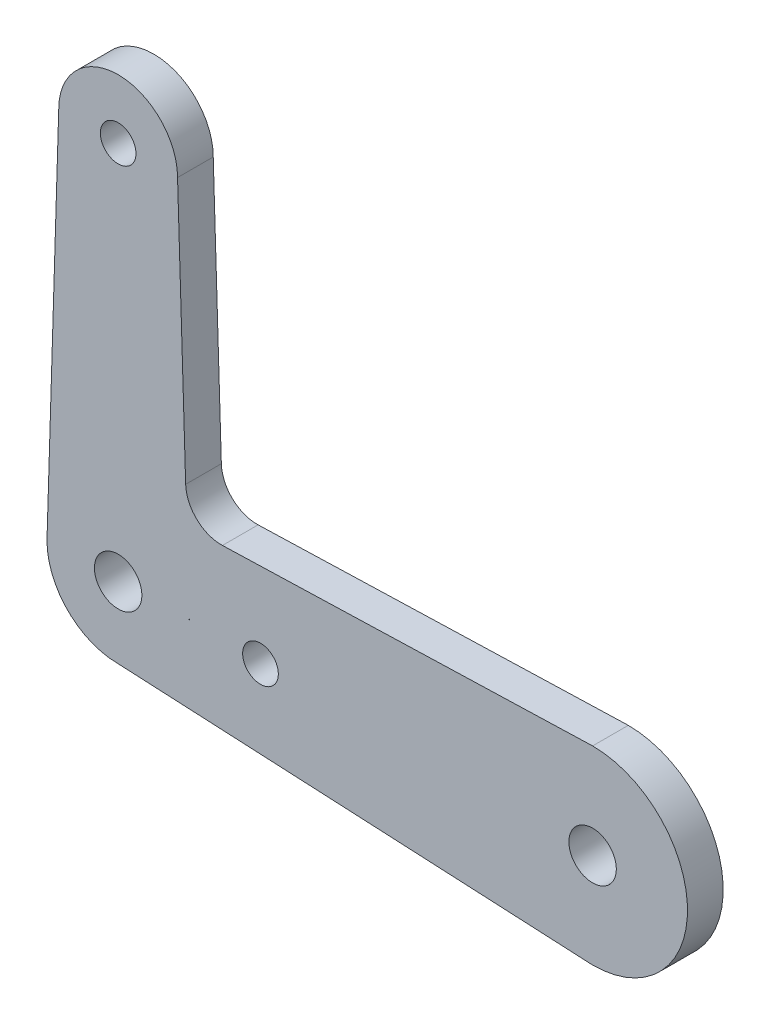
ISO-10303-21;
HEADER;
FILE_DESCRIPTION(('STEP AP214'),'2;1');
FILE_NAME('part.step','',(''),(''),'','','');
FILE_SCHEMA(('AUTOMOTIVE_DESIGN { 1 0 10303 214 1 1 1 1 }'));
ENDSEC;
DATA;
#1=APPLICATION_CONTEXT('core data for automotive mechanical design processes');
#2=APPLICATION_PROTOCOL_DEFINITION('international standard','automotive_design',2000,#1);
#3=PRODUCT_CONTEXT('',#1,'mechanical');
#4=PRODUCT('Part','Part','',(#3));
#5=PRODUCT_RELATED_PRODUCT_CATEGORY('part','',(#4));
#6=PRODUCT_DEFINITION_FORMATION('','',#4);
#7=PRODUCT_DEFINITION_CONTEXT('part definition',#1,'design');
#8=PRODUCT_DEFINITION('design','',#6,#7);
#9=PRODUCT_DEFINITION_SHAPE('','',#8);
#10=(LENGTH_UNIT() NAMED_UNIT(*) SI_UNIT(.MILLI.,.METRE.));
#11=(NAMED_UNIT(*) PLANE_ANGLE_UNIT() SI_UNIT($,.RADIAN.));
#12=(NAMED_UNIT(*) SI_UNIT($,.STERADIAN.) SOLID_ANGLE_UNIT());
#13=UNCERTAINTY_MEASURE_WITH_UNIT(LENGTH_MEASURE(1.E-05),#10,'distance_accuracy_value','');
#14=(GEOMETRIC_REPRESENTATION_CONTEXT(3) GLOBAL_UNCERTAINTY_ASSIGNED_CONTEXT((#13)) GLOBAL_UNIT_ASSIGNED_CONTEXT((#10,
#11,#12)) REPRESENTATION_CONTEXT('',''));
#15=CARTESIAN_POINT('',(0.,0.,0.));
#16=DIRECTION('',(0.,0.,1.));
#17=DIRECTION('',(1.,0.,0.));
#18=AXIS2_PLACEMENT_3D('',#15,#16,#17);
#19=CARTESIAN_POINT('',(-0.475062344139632,-9.50124688279302,4.7752));
#20=DIRECTION('',(0.0499376169438923,0.998752338877845,0.));
#21=DIRECTION('',(-0.998752338877846,0.0499376169438924,0.));
#22=AXIS2_PLACEMENT_3D('',#19,#20,#21);
#23=PLANE('',#22);
#24=DIRECTION('',(0.998752338877845,-0.0499376169438923,0.));
#25=VECTOR('',#24,1.);
#26=CARTESIAN_POINT('',(-0.475062344139646,-9.50124688279302,0.));
#27=LINE('',#26,#25);
#28=CARTESIAN_POINT('',(0.,-9.52500000000002,0.));
#29=VERTEX_POINT('',#28);
#30=CARTESIAN_POINT('',(63.5000000000001,-12.7,0.));
#31=VERTEX_POINT('',#30);
#32=EDGE_CURVE('E161',#29,#31,#27,.T.);
#33=ORIENTED_EDGE('',*,*,#32,.T.);
#34=DIRECTION('',(0.,0.,-1.));
#35=VECTOR('',#34,1.);
#36=CARTESIAN_POINT('',(63.5000000000001,-12.7,4.7752));
#37=LINE('',#36,#35);
#38=CARTESIAN_POINT('',(63.5000000000001,-12.7,4.7752));
#39=VERTEX_POINT('',#38);
#40=EDGE_CURVE('E187',#39,#31,#37,.T.);
#41=ORIENTED_EDGE('',*,*,#40,.F.);
#42=DIRECTION('',(0.998752338877845,-0.0499376169438923,0.));
#43=VECTOR('',#42,1.);
#44=CARTESIAN_POINT('',(-0.475062344139632,-9.50124688279302,4.7752));
#45=LINE('',#44,#43);
#46=CARTESIAN_POINT('',(0.,-9.52500000000002,4.7752));
#47=VERTEX_POINT('',#46);
#48=EDGE_CURVE('E131',#47,#39,#45,.T.);
#49=ORIENTED_EDGE('',*,*,#48,.F.);
#50=DIRECTION('',(0.,0.,-1.));
#51=VECTOR('',#50,1.);
#52=CARTESIAN_POINT('',(0.,-9.52500000000002,4.7752));
#53=LINE('',#52,#51);
#54=EDGE_CURVE('E124',#47,#29,#53,.T.);
#55=ORIENTED_EDGE('',*,*,#54,.T.);
#56=EDGE_LOOP('',(#33,#41,#49,#55));
#57=FACE_BOUND('',#56,.T.);
#58=ADVANCED_FACE('F37',(#57),#23,.F.);
#59=CARTESIAN_POINT('',(63.5000000000001,0.,4.7752));
#60=DIRECTION('',(0.,0.,-1.));
#61=DIRECTION('',(-1.,0.,0.));
#62=AXIS2_PLACEMENT_3D('',#59,#60,#61);
#63=CYLINDRICAL_SURFACE('',#62,12.7);
#64=CARTESIAN_POINT('',(63.5000000000001,0.,0.));
#65=DIRECTION('',(0.,0.,1.));
#66=DIRECTION('',(1.,0.,0.));
#67=AXIS2_PLACEMENT_3D('',#64,#65,#66);
#68=CIRCLE('',#67,12.7);
#69=CARTESIAN_POINT('',(63.5000000000001,12.7,0.));
#70=VERTEX_POINT('',#69);
#71=EDGE_CURVE('E164',#31,#70,#68,.T.);
#72=ORIENTED_EDGE('',*,*,#71,.T.);
#73=DIRECTION('',(0.,0.,-1.));
#74=VECTOR('',#73,1.);
#75=CARTESIAN_POINT('',(63.5000000000001,12.7,4.7752));
#76=LINE('',#75,#74);
#77=CARTESIAN_POINT('',(63.5000000000001,12.7,4.7752));
#78=VERTEX_POINT('',#77);
#79=EDGE_CURVE('E184',#78,#70,#76,.T.);
#80=ORIENTED_EDGE('',*,*,#79,.F.);
#81=CARTESIAN_POINT('',(63.5000000000001,0.,4.7752));
#82=DIRECTION('',(0.,0.,1.));
#83=DIRECTION('',(1.,0.,0.));
#84=AXIS2_PLACEMENT_3D('',#81,#82,#83);
#85=CIRCLE('',#84,12.7);
#86=EDGE_CURVE('E145',#39,#78,#85,.T.);
#87=ORIENTED_EDGE('',*,*,#86,.F.);
#88=ORIENTED_EDGE('',*,*,#40,.T.);
#89=EDGE_LOOP('',(#72,#80,#87,#88));
#90=FACE_BOUND('',#89,.T.);
#91=ADVANCED_FACE('F228',(#90),#63,.T.);
#92=CARTESIAN_POINT('',(-0.332357104822267,10.7211969297505,4.7752));
#93=DIRECTION('',(0.0309851152273412,-0.999519846043264,0.));
#94=DIRECTION('',(0.999519846043264,0.0309851152273412,0.));
#95=AXIS2_PLACEMENT_3D('',#92,#93,#94);
#96=PLANE('',#95);
#97=DIRECTION('',(-0.999519846043264,-0.0309851152273412,0.));
#98=VECTOR('',#97,1.);
#99=CARTESIAN_POINT('',(-0.332357104822281,10.7211969297505,0.));
#100=LINE('',#99,#98);
#101=CARTESIAN_POINT('',(13.9564053270957,11.16414856514,0.));
#102=VERTEX_POINT('',#101);
#103=EDGE_CURVE('E166',#70,#102,#100,.T.);
#104=ORIENTED_EDGE('',*,*,#103,.T.);
#105=DIRECTION('',(0.,0.,-1.));
#106=VECTOR('',#105,1.);
#107=CARTESIAN_POINT('',(13.9564053270957,11.16414856514,4.7752));
#108=LINE('',#107,#106);
#109=CARTESIAN_POINT('',(13.9564053270957,11.16414856514,4.7752));
#110=VERTEX_POINT('',#109);
#111=EDGE_CURVE('E52',#102,#110,#108,.F.);
#112=ORIENTED_EDGE('',*,*,#111,.T.);
#113=DIRECTION('',(-0.999519846043264,-0.0309851152273412,0.));
#114=VECTOR('',#113,1.);
#115=CARTESIAN_POINT('',(-0.332357104822267,10.7211969297505,4.7752));
#116=LINE('',#115,#114);
#117=EDGE_CURVE('E147',#78,#110,#116,.T.);
#118=ORIENTED_EDGE('',*,*,#117,.F.);
#119=ORIENTED_EDGE('',*,*,#79,.T.);
#120=EDGE_LOOP('',(#104,#112,#118,#119));
#121=FACE_BOUND('',#120,.T.);
#122=ADVANCED_FACE('F234',(#121),#96,.F.);
#123=CARTESIAN_POINT('',(9.51585526309218,0.294991513155853,4.7752));
#124=DIRECTION('',(-0.999519846043264,-0.0309851152273412,0.));
#125=DIRECTION('',(0.0309851152273412,-0.999519846043264,0.));
#126=AXIS2_PLACEMENT_3D('',#123,#124,#125);
#127=PLANE('',#126);
#128=DIRECTION('',(-0.0309851152273412,0.999519846043264,0.));
#129=VECTOR('',#128,1.);
#130=CARTESIAN_POINT('',(9.51585526309218,0.294991513155853,4.7752));
#131=LINE('',#130,#129);
#132=CARTESIAN_POINT('',(9.03553803603632,15.7890956117322,4.7752));
#133=VERTEX_POINT('',#132);
#134=CARTESIAN_POINT('',(7.95020000000002,50.8,4.7752));
#135=VERTEX_POINT('',#134);
#136=EDGE_CURVE('E149',#133,#135,#131,.T.);
#137=ORIENTED_EDGE('',*,*,#136,.F.);
#138=DIRECTION('',(0.,0.,-1.));
#139=VECTOR('',#138,1.);
#140=CARTESIAN_POINT('',(9.03553803603631,15.7890956117322,0.));
#141=LINE('',#140,#139);
#142=CARTESIAN_POINT('',(9.03553803603631,15.7890956117322,0.));
#143=VERTEX_POINT('',#142);
#144=EDGE_CURVE('E190',#133,#143,#141,.T.);
#145=ORIENTED_EDGE('',*,*,#144,.T.);
#146=DIRECTION('',(-0.0309851152273412,0.999519846043264,0.));
#147=VECTOR('',#146,1.);
#148=CARTESIAN_POINT('',(9.51585526309216,0.294991513155853,0.));
#149=LINE('',#148,#147);
#150=CARTESIAN_POINT('',(7.95020000000003,50.8,0.));
#151=VERTEX_POINT('',#150);
#152=EDGE_CURVE('E168',#143,#151,#149,.T.);
#153=ORIENTED_EDGE('',*,*,#152,.T.);
#154=DIRECTION('',(0.,0.,-1.));
#155=VECTOR('',#154,1.);
#156=CARTESIAN_POINT('',(7.95020000000002,50.8,4.7752));
#157=LINE('',#156,#155);
#158=EDGE_CURVE('E181',#135,#151,#157,.T.);
#159=ORIENTED_EDGE('',*,*,#158,.F.);
#160=EDGE_LOOP('',(#137,#145,#153,#159));
#161=FACE_BOUND('',#160,.T.);
#162=ADVANCED_FACE('F197',(#161),#127,.F.);
#163=CARTESIAN_POINT('',(0.,50.8,4.7752));
#164=DIRECTION('',(0.,0.,-1.));
#165=DIRECTION('',(-1.,0.,0.));
#166=AXIS2_PLACEMENT_3D('',#163,#164,#165);
#167=CYLINDRICAL_SURFACE('',#166,7.9502);
#168=CARTESIAN_POINT('',(0.,50.8,0.));
#169=DIRECTION('',(0.,0.,1.));
#170=DIRECTION('',(1.,0.,0.));
#171=AXIS2_PLACEMENT_3D('',#168,#169,#170);
#172=CIRCLE('',#171,7.9502);
#173=CARTESIAN_POINT('',(-7.9502,50.8,0.));
#174=VERTEX_POINT('',#173);
#175=EDGE_CURVE('E170',#151,#174,#172,.T.);
#176=ORIENTED_EDGE('',*,*,#175,.T.);
#177=DIRECTION('',(0.,0.,-1.));
#178=VECTOR('',#177,1.);
#179=CARTESIAN_POINT('',(-7.9502,50.8,4.7752));
#180=LINE('',#179,#178);
#181=CARTESIAN_POINT('',(-7.9502,50.8,4.7752));
#182=VERTEX_POINT('',#181);
#183=EDGE_CURVE('E178',#182,#174,#180,.T.);
#184=ORIENTED_EDGE('',*,*,#183,.F.);
#185=CARTESIAN_POINT('',(0.,50.8,4.7752));
#186=DIRECTION('',(0.,0.,1.));
#187=DIRECTION('',(1.,0.,0.));
#188=AXIS2_PLACEMENT_3D('',#185,#186,#187);
#189=CIRCLE('',#188,7.9502);
#190=EDGE_CURVE('E151',#135,#182,#189,.T.);
#191=ORIENTED_EDGE('',*,*,#190,.F.);
#192=ORIENTED_EDGE('',*,*,#158,.T.);
#193=EDGE_LOOP('',(#176,#184,#191,#192));
#194=FACE_BOUND('',#193,.T.);
#195=ADVANCED_FACE('F208',(#194),#167,.T.);
#196=CARTESIAN_POINT('',(-9.51585526309218,0.294991513155873,4.7752));
#197=DIRECTION('',(0.999519846043264,-0.0309851152273413,0.));
#198=DIRECTION('',(0.0309851152273413,0.999519846043264,0.));
#199=AXIS2_PLACEMENT_3D('',#196,#197,#198);
#200=PLANE('',#199);
#201=DIRECTION('',(-0.0309851152273413,-0.999519846043264,0.));
#202=VECTOR('',#201,1.);
#203=CARTESIAN_POINT('',(-9.51585526309218,0.294991513155873,0.));
#204=LINE('',#203,#202);
#205=CARTESIAN_POINT('',(-9.52499999999998,0.,0.));
#206=VERTEX_POINT('',#205);
#207=EDGE_CURVE('E137',#174,#206,#204,.T.);
#208=ORIENTED_EDGE('',*,*,#207,.T.);
#209=DIRECTION('',(0.,0.,-1.));
#210=VECTOR('',#209,1.);
#211=CARTESIAN_POINT('',(-9.52499999999998,0.,4.7752));
#212=LINE('',#211,#210);
#213=CARTESIAN_POINT('',(-9.52499999999998,0.,4.7752));
#214=VERTEX_POINT('',#213);
#215=EDGE_CURVE('E175',#214,#206,#212,.T.);
#216=ORIENTED_EDGE('',*,*,#215,.F.);
#217=DIRECTION('',(-0.0309851152273413,-0.999519846043264,0.));
#218=VECTOR('',#217,1.);
#219=CARTESIAN_POINT('',(-9.51585526309218,0.294991513155873,4.7752));
#220=LINE('',#219,#218);
#221=EDGE_CURVE('E153',#182,#214,#220,.T.);
#222=ORIENTED_EDGE('',*,*,#221,.F.);
#223=ORIENTED_EDGE('',*,*,#183,.T.);
#224=EDGE_LOOP('',(#208,#216,#222,#223));
#225=FACE_BOUND('',#224,.T.);
#226=ADVANCED_FACE('F212',(#225),#200,.F.);
#227=CARTESIAN_POINT('',(0.,0.,4.7752));
#228=DIRECTION('',(0.,0.,-1.));
#229=DIRECTION('',(-1.,0.,0.));
#230=AXIS2_PLACEMENT_3D('',#227,#228,#229);
#231=CYLINDRICAL_SURFACE('',#230,9.525);
#232=CARTESIAN_POINT('',(0.,0.,0.));
#233=DIRECTION('',(0.,0.,1.));
#234=DIRECTION('',(1.,0.,0.));
#235=AXIS2_PLACEMENT_3D('',#232,#233,#234);
#236=CIRCLE('',#235,9.525);
#237=CARTESIAN_POINT('',(9.52500000000002,0.,0.));
#238=VERTEX_POINT('',#237);
#239=CARTESIAN_POINT('',(9.50671052618433,0.589983026311691,0.));
#240=VERTEX_POINT('',#239);
#241=EDGE_CURVE('E120',#238,#240,#236,.T.);
#242=ORIENTED_EDGE('',*,*,#241,.F.);
#243=DIRECTION('',(0.,0.,-1.));
#244=VECTOR('',#243,1.);
#245=CARTESIAN_POINT('',(9.52500000000001,0.,4.7752));
#246=LINE('',#245,#244);
#247=CARTESIAN_POINT('',(9.52500000000001,0.,4.7752));
#248=VERTEX_POINT('',#247);
#249=EDGE_CURVE('E114',#248,#238,#246,.T.);
#250=ORIENTED_EDGE('',*,*,#249,.F.);
#251=CARTESIAN_POINT('',(0.,0.,4.7752));
#252=DIRECTION('',(0.,0.,1.));
#253=DIRECTION('',(1.,0.,0.));
#254=AXIS2_PLACEMENT_3D('',#251,#252,#253);
#255=CIRCLE('',#254,9.525);
#256=CARTESIAN_POINT('',(9.50671052618435,0.589983026311691,4.7752));
#257=VERTEX_POINT('',#256);
#258=EDGE_CURVE('E118',#248,#257,#255,.T.);
#259=ORIENTED_EDGE('',*,*,#258,.T.);
#260=DIRECTION('',(0.,0.,-1.));
#261=VECTOR('',#260,1.);
#262=CARTESIAN_POINT('',(9.50671052618435,0.589983026311691,4.7752));
#263=LINE('',#262,#261);
#264=EDGE_CURVE('E125',#257,#240,#263,.T.);
#265=ORIENTED_EDGE('',*,*,#264,.T.);
#266=EDGE_LOOP('',(#242,#250,#259,#265));
#267=FACE_BOUND('',#266,.T.);
#268=ADVANCED_FACE('F116',(#267),#231,.F.);
#269=CARTESIAN_POINT('',(9.51585526309216,0.294991513155832,4.7752));
#270=DIRECTION('',(-0.999519846043264,-0.0309851152273391,0.));
#271=DIRECTION('',(0.0309851152273391,-0.999519846043264,0.));
#272=AXIS2_PLACEMENT_3D('',#269,#270,#271);
#273=PLANE('',#272);
#274=DIRECTION('',(-0.0309851152273391,0.999519846043264,0.));
#275=VECTOR('',#274,1.);
#276=CARTESIAN_POINT('',(9.51585526309216,0.294991513155832,0.));
#277=LINE('',#276,#275);
#278=EDGE_CURVE('E158',#238,#240,#277,.T.);
#279=ORIENTED_EDGE('',*,*,#278,.T.);
#280=ORIENTED_EDGE('',*,*,#264,.F.);
#281=DIRECTION('',(-0.0309851152273391,0.999519846043264,0.));
#282=VECTOR('',#281,1.);
#283=CARTESIAN_POINT('',(9.51585526309216,0.294991513155832,4.7752));
#284=LINE('',#283,#282);
#285=EDGE_CURVE('E128',#248,#257,#284,.T.);
#286=ORIENTED_EDGE('',*,*,#285,.F.);
#287=ORIENTED_EDGE('',*,*,#249,.T.);
#288=EDGE_LOOP('',(#279,#280,#286,#287));
#289=FACE_BOUND('',#288,.T.);
#290=ADVANCED_FACE('F129',(#289),#273,.F.);
#291=CARTESIAN_POINT('',(0.,0.,4.7752));
#292=DIRECTION('',(0.,0.,-1.));
#293=DIRECTION('',(-1.,0.,0.));
#294=AXIS2_PLACEMENT_3D('',#291,#292,#293);
#295=CYLINDRICAL_SURFACE('',#294,9.525);
#296=CARTESIAN_POINT('',(0.,0.,0.));
#297=DIRECTION('',(0.,0.,1.));
#298=DIRECTION('',(1.,0.,0.));
#299=AXIS2_PLACEMENT_3D('',#296,#297,#298);
#300=CIRCLE('',#299,9.525);
#301=EDGE_CURVE('E135',#206,#29,#300,.T.);
#302=ORIENTED_EDGE('',*,*,#301,.T.);
#303=ORIENTED_EDGE('',*,*,#54,.F.);
#304=CARTESIAN_POINT('',(0.,0.,4.7752));
#305=DIRECTION('',(0.,0.,1.));
#306=DIRECTION('',(1.,0.,0.));
#307=AXIS2_PLACEMENT_3D('',#304,#305,#306);
#308=CIRCLE('',#307,9.525);
#309=EDGE_CURVE('E155',#214,#47,#308,.T.);
#310=ORIENTED_EDGE('',*,*,#309,.F.);
#311=ORIENTED_EDGE('',*,*,#215,.T.);
#312=EDGE_LOOP('',(#302,#303,#310,#311));
#313=FACE_BOUND('',#312,.T.);
#314=ADVANCED_FACE('F240',(#313),#295,.T.);
#315=CARTESIAN_POINT('',(0.,0.,4.7752));
#316=DIRECTION('',(0.,0.,1.));
#317=DIRECTION('',(1.,0.,0.));
#318=AXIS2_PLACEMENT_3D('',#315,#316,#317);
#319=PLANE('',#318);
#320=CARTESIAN_POINT('',(63.5000000000001,0.,4.7752));
#321=DIRECTION('',(0.,0.,1.));
#322=DIRECTION('',(1.,0.,0.));
#323=AXIS2_PLACEMENT_3D('',#320,#321,#322);
#324=CIRCLE('',#323,3.175);
#325=CARTESIAN_POINT('',(66.6750000000001,0.,4.7752));
#326=VERTEX_POINT('',#325);
#327=EDGE_CURVE('E303',#326,#326,#324,.T.);
#328=ORIENTED_EDGE('',*,*,#327,.F.);
#329=EDGE_LOOP('',(#328));
#330=FACE_BOUND('',#329,.T.);
#331=CARTESIAN_POINT('',(19.05,0.,4.7752));
#332=DIRECTION('',(0.,0.,1.));
#333=DIRECTION('',(1.,0.,0.));
#334=AXIS2_PLACEMENT_3D('',#331,#332,#333);
#335=CIRCLE('',#334,2.3876);
#336=CARTESIAN_POINT('',(21.4376,0.,4.7752));
#337=VERTEX_POINT('',#336);
#338=EDGE_CURVE('E295',#337,#337,#335,.T.);
#339=ORIENTED_EDGE('',*,*,#338,.F.);
#340=EDGE_LOOP('',(#339));
#341=FACE_BOUND('',#340,.T.);
#342=CARTESIAN_POINT('',(0.,50.8,4.7752));
#343=DIRECTION('',(0.,0.,1.));
#344=DIRECTION('',(1.,0.,0.));
#345=AXIS2_PLACEMENT_3D('',#342,#343,#344);
#346=CIRCLE('',#345,2.3876);
#347=CARTESIAN_POINT('',(2.38760000000001,50.8,4.7752));
#348=VERTEX_POINT('',#347);
#349=EDGE_CURVE('E289',#348,#348,#346,.T.);
#350=ORIENTED_EDGE('',*,*,#349,.F.);
#351=EDGE_LOOP('',(#350));
#352=FACE_BOUND('',#351,.T.);
#353=CARTESIAN_POINT('',(0.,0.,4.7752));
#354=DIRECTION('',(0.,0.,1.));
#355=DIRECTION('',(1.,0.,0.));
#356=AXIS2_PLACEMENT_3D('',#353,#354,#355);
#357=CIRCLE('',#356,3.175);
#358=CARTESIAN_POINT('',(3.17500000000002,0.,4.7752));
#359=VERTEX_POINT('',#358);
#360=EDGE_CURVE('E140',#359,#359,#357,.T.);
#361=ORIENTED_EDGE('',*,*,#360,.F.);
#362=EDGE_LOOP('',(#361));
#363=FACE_BOUND('',#362,.T.);
#364=ORIENTED_EDGE('',*,*,#258,.F.);
#365=ORIENTED_EDGE('',*,*,#285,.T.);
#366=EDGE_LOOP('',(#364,#365));
#367=FACE_BOUND('',#366,.T.);
#368=ORIENTED_EDGE('',*,*,#48,.T.);
#369=ORIENTED_EDGE('',*,*,#86,.T.);
#370=ORIENTED_EDGE('',*,*,#117,.T.);
#371=CARTESIAN_POINT('',(13.8084452048621,15.9370557339658,4.7752));
#372=DIRECTION('',(0.,0.,1.));
#373=DIRECTION('',(1.,0.,0.));
#374=AXIS2_PLACEMENT_3D('',#371,#372,#373);
#375=CIRCLE('',#374,4.7752);
#376=EDGE_CURVE('E11',#110,#133,#375,.F.);
#377=ORIENTED_EDGE('',*,*,#376,.T.);
#378=ORIENTED_EDGE('',*,*,#136,.T.);
#379=ORIENTED_EDGE('',*,*,#190,.T.);
#380=ORIENTED_EDGE('',*,*,#221,.T.);
#381=ORIENTED_EDGE('',*,*,#309,.T.);
#382=EDGE_LOOP('',(#368,#369,#370,#377,#378,#379,#380,#381));
#383=FACE_BOUND('',#382,.T.);
#384=ADVANCED_FACE('F133',(#330,#341,#352,#363,#367,#383),#319,.T.);
#385=CARTESIAN_POINT('',(0.,0.,0.));
#386=DIRECTION('',(0.,0.,1.));
#387=DIRECTION('',(1.,0.,0.));
#388=AXIS2_PLACEMENT_3D('',#385,#386,#387);
#389=PLANE('',#388);
#390=CARTESIAN_POINT('',(63.5000000000001,0.,0.));
#391=DIRECTION('',(0.,0.,1.));
#392=DIRECTION('',(1.,0.,0.));
#393=AXIS2_PLACEMENT_3D('',#390,#391,#392);
#394=CIRCLE('',#393,3.175);
#395=CARTESIAN_POINT('',(66.6750000000001,0.,0.));
#396=VERTEX_POINT('',#395);
#397=EDGE_CURVE('E300',#396,#396,#394,.T.);
#398=ORIENTED_EDGE('',*,*,#397,.T.);
#399=EDGE_LOOP('',(#398));
#400=FACE_BOUND('',#399,.T.);
#401=CARTESIAN_POINT('',(19.05,0.,0.));
#402=DIRECTION('',(0.,0.,1.));
#403=DIRECTION('',(1.,0.,0.));
#404=AXIS2_PLACEMENT_3D('',#401,#402,#403);
#405=CIRCLE('',#404,2.3876);
#406=CARTESIAN_POINT('',(21.4376,0.,0.));
#407=VERTEX_POINT('',#406);
#408=EDGE_CURVE('E291',#407,#407,#405,.T.);
#409=ORIENTED_EDGE('',*,*,#408,.T.);
#410=EDGE_LOOP('',(#409));
#411=FACE_BOUND('',#410,.T.);
#412=CARTESIAN_POINT('',(0.,50.8,0.));
#413=DIRECTION('',(0.,0.,1.));
#414=DIRECTION('',(1.,0.,0.));
#415=AXIS2_PLACEMENT_3D('',#412,#413,#414);
#416=CIRCLE('',#415,2.3876);
#417=CARTESIAN_POINT('',(2.38760000000001,50.8,0.));
#418=VERTEX_POINT('',#417);
#419=EDGE_CURVE('E286',#418,#418,#416,.T.);
#420=ORIENTED_EDGE('',*,*,#419,.T.);
#421=EDGE_LOOP('',(#420));
#422=FACE_BOUND('',#421,.T.);
#423=CARTESIAN_POINT('',(0.,0.,0.));
#424=DIRECTION('',(0.,0.,1.));
#425=DIRECTION('',(1.,0.,0.));
#426=AXIS2_PLACEMENT_3D('',#423,#424,#425);
#427=CIRCLE('',#426,3.175);
#428=CARTESIAN_POINT('',(3.175,0.,0.));
#429=VERTEX_POINT('',#428);
#430=EDGE_CURVE('E159',#429,#429,#427,.T.);
#431=ORIENTED_EDGE('',*,*,#430,.T.);
#432=EDGE_LOOP('',(#431));
#433=FACE_BOUND('',#432,.T.);
#434=ORIENTED_EDGE('',*,*,#241,.T.);
#435=ORIENTED_EDGE('',*,*,#278,.F.);
#436=EDGE_LOOP('',(#434,#435));
#437=FACE_BOUND('',#436,.T.);
#438=ORIENTED_EDGE('',*,*,#32,.F.);
#439=ORIENTED_EDGE('',*,*,#301,.F.);
#440=ORIENTED_EDGE('',*,*,#207,.F.);
#441=ORIENTED_EDGE('',*,*,#175,.F.);
#442=ORIENTED_EDGE('',*,*,#152,.F.);
#443=CARTESIAN_POINT('',(13.8084452048621,15.9370557339658,0.));
#444=DIRECTION('',(0.,0.,1.));
#445=DIRECTION('',(1.,0.,0.));
#446=AXIS2_PLACEMENT_3D('',#443,#444,#445);
#447=CIRCLE('',#446,4.7752);
#448=EDGE_CURVE('E45',#143,#102,#447,.T.);
#449=ORIENTED_EDGE('',*,*,#448,.T.);
#450=ORIENTED_EDGE('',*,*,#103,.F.);
#451=ORIENTED_EDGE('',*,*,#71,.F.);
#452=EDGE_LOOP('',(#438,#439,#440,#441,#442,#449,#450,#451));
#453=FACE_BOUND('',#452,.T.);
#454=ADVANCED_FACE('F203',(#400,#411,#422,#433,#437,#453),#389,.F.);
#455=CARTESIAN_POINT('',(13.8084452048621,15.9370557339658,4.7752));
#456=DIRECTION('',(0.,0.,1.));
#457=DIRECTION('',(1.,0.,0.));
#458=AXIS2_PLACEMENT_3D('',#455,#456,#457);
#459=CYLINDRICAL_SURFACE('',#458,4.7752);
#460=ORIENTED_EDGE('',*,*,#376,.F.);
#461=ORIENTED_EDGE('',*,*,#111,.F.);
#462=ORIENTED_EDGE('',*,*,#448,.F.);
#463=ORIENTED_EDGE('',*,*,#144,.F.);
#464=EDGE_LOOP('',(#460,#461,#462,#463));
#465=FACE_BOUND('',#464,.T.);
#466=ADVANCED_FACE('F39',(#465),#459,.F.);
#467=CARTESIAN_POINT('',(0.,0.,0.));
#468=DIRECTION('',(0.,0.,1.));
#469=DIRECTION('',(1.,0.,0.));
#470=AXIS2_PLACEMENT_3D('',#467,#468,#469);
#471=CYLINDRICAL_SURFACE('',#470,3.175);
#472=ORIENTED_EDGE('',*,*,#430,.F.);
#473=EDGE_LOOP('',(#472));
#474=FACE_BOUND('',#473,.T.);
#475=ORIENTED_EDGE('',*,*,#360,.T.);
#476=EDGE_LOOP('',(#475));
#477=FACE_BOUND('',#476,.T.);
#478=ADVANCED_FACE('F217',(#474,#477),#471,.F.);
#479=CARTESIAN_POINT('',(0.,50.8,0.));
#480=DIRECTION('',(0.,0.,1.));
#481=DIRECTION('',(1.,0.,0.));
#482=AXIS2_PLACEMENT_3D('',#479,#480,#481);
#483=CYLINDRICAL_SURFACE('',#482,2.3876);
#484=ORIENTED_EDGE('',*,*,#419,.F.);
#485=EDGE_LOOP('',(#484));
#486=FACE_BOUND('',#485,.T.);
#487=ORIENTED_EDGE('',*,*,#349,.T.);
#488=EDGE_LOOP('',(#487));
#489=FACE_BOUND('',#488,.T.);
#490=ADVANCED_FACE('F222',(#486,#489),#483,.F.);
#491=CARTESIAN_POINT('',(19.05,0.,0.));
#492=DIRECTION('',(0.,0.,1.));
#493=DIRECTION('',(1.,0.,0.));
#494=AXIS2_PLACEMENT_3D('',#491,#492,#493);
#495=CYLINDRICAL_SURFACE('',#494,2.3876);
#496=ORIENTED_EDGE('',*,*,#408,.F.);
#497=EDGE_LOOP('',(#496));
#498=FACE_BOUND('',#497,.T.);
#499=ORIENTED_EDGE('',*,*,#338,.T.);
#500=EDGE_LOOP('',(#499));
#501=FACE_BOUND('',#500,.T.);
#502=ADVANCED_FACE('F274',(#498,#501),#495,.F.);
#503=CARTESIAN_POINT('',(63.5000000000001,0.,0.));
#504=DIRECTION('',(0.,0.,1.));
#505=DIRECTION('',(1.,0.,0.));
#506=AXIS2_PLACEMENT_3D('',#503,#504,#505);
#507=CYLINDRICAL_SURFACE('',#506,3.175);
#508=ORIENTED_EDGE('',*,*,#397,.F.);
#509=EDGE_LOOP('',(#508));
#510=FACE_BOUND('',#509,.T.);
#511=ORIENTED_EDGE('',*,*,#327,.T.);
#512=EDGE_LOOP('',(#511));
#513=FACE_BOUND('',#512,.T.);
#514=ADVANCED_FACE('F271',(#510,#513),#507,.F.);
#515=CLOSED_SHELL('',(#58,#91,#122,#162,#195,#226,#268,#290,#314,#384,#454,#466,#478,#490,#502,#514));
#516=MANIFOLD_SOLID_BREP('B2',#515);
#517=ADVANCED_BREP_SHAPE_REPRESENTATION('',(#18,#516),#14);
#518=SHAPE_DEFINITION_REPRESENTATION(#9,#517);
ENDSEC;
END-ISO-10303-21;
